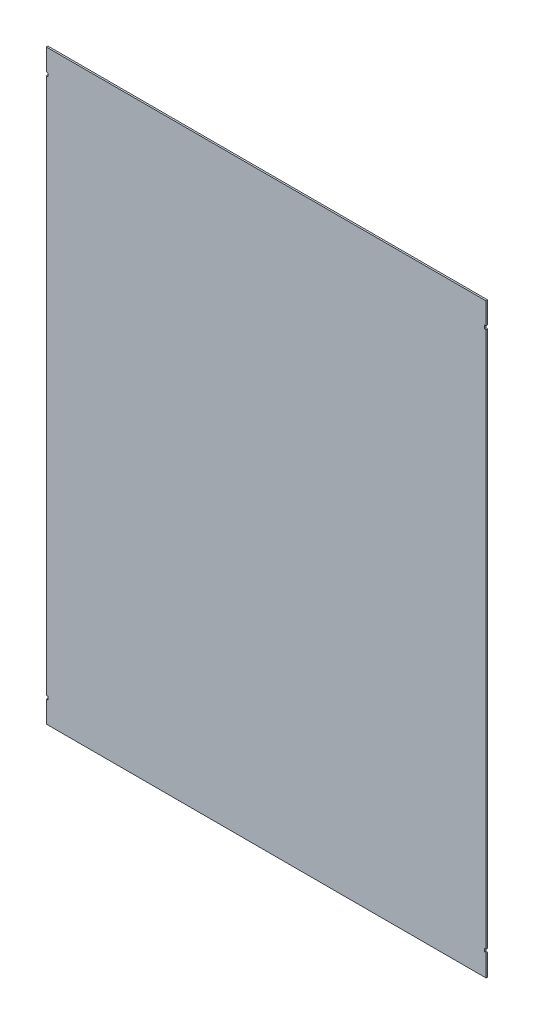
ISO-10303-21;
HEADER;
FILE_DESCRIPTION(('STEP AP214'),'2;1');
FILE_NAME('part.step','',(''),(''),'','','');
FILE_SCHEMA(('AUTOMOTIVE_DESIGN { 1 0 10303 214 1 1 1 1 }'));
ENDSEC;
DATA;
#1=APPLICATION_CONTEXT('core data for automotive mechanical design processes');
#2=APPLICATION_PROTOCOL_DEFINITION('international standard','automotive_design',2000,#1);
#3=PRODUCT_CONTEXT('',#1,'mechanical');
#4=PRODUCT('Part','Part','',(#3));
#5=PRODUCT_RELATED_PRODUCT_CATEGORY('part','',(#4));
#6=PRODUCT_DEFINITION_FORMATION('','',#4);
#7=PRODUCT_DEFINITION_CONTEXT('part definition',#1,'design');
#8=PRODUCT_DEFINITION('design','',#6,#7);
#9=PRODUCT_DEFINITION_SHAPE('','',#8);
#10=(LENGTH_UNIT() NAMED_UNIT(*) SI_UNIT(.MILLI.,.METRE.));
#11=(NAMED_UNIT(*) PLANE_ANGLE_UNIT() SI_UNIT($,.RADIAN.));
#12=(NAMED_UNIT(*) SI_UNIT($,.STERADIAN.) SOLID_ANGLE_UNIT());
#13=UNCERTAINTY_MEASURE_WITH_UNIT(LENGTH_MEASURE(1.E-05),#10,'distance_accuracy_value','');
#14=(GEOMETRIC_REPRESENTATION_CONTEXT(3) GLOBAL_UNCERTAINTY_ASSIGNED_CONTEXT((#13)) GLOBAL_UNIT_ASSIGNED_CONTEXT((#10,
#11,#12)) REPRESENTATION_CONTEXT('',''));
#15=CARTESIAN_POINT('',(0.,0.,0.));
#16=DIRECTION('',(0.,0.,1.));
#17=DIRECTION('',(1.,0.,0.));
#18=AXIS2_PLACEMENT_3D('',#15,#16,#17);
#19=CARTESIAN_POINT('',(0.,0.,3.175));
#20=DIRECTION('',(0.,0.,-1.));
#21=DIRECTION('',(-1.,0.,0.));
#22=AXIS2_PLACEMENT_3D('',#19,#20,#21);
#23=PLANE('',#22);
#24=DIRECTION('',(-1.,0.,0.));
#25=VECTOR('',#24,1.);
#26=CARTESIAN_POINT('',(838.2,1069.99545320751,3.175));
#27=LINE('',#26,#25);
#28=CARTESIAN_POINT('',(838.2,1069.99545320751,3.175));
#29=VERTEX_POINT('',#28);
#30=CARTESIAN_POINT('',(835.025,1069.99545320751,3.175));
#31=VERTEX_POINT('',#30);
#32=EDGE_CURVE('E264',#29,#31,#27,.T.);
#33=ORIENTED_EDGE('',*,*,#32,.T.);
#34=DIRECTION('',(0.,1.,0.));
#35=VECTOR('',#34,1.);
#36=CARTESIAN_POINT('',(835.025,1076.34545320751,3.175));
#37=LINE('',#36,#35);
#38=CARTESIAN_POINT('',(835.025,1076.34545320751,3.175));
#39=VERTEX_POINT('',#38);
#40=EDGE_CURVE('E191',#31,#39,#37,.T.);
#41=ORIENTED_EDGE('',*,*,#40,.T.);
#42=DIRECTION('',(1.,0.,0.));
#43=VECTOR('',#42,1.);
#44=CARTESIAN_POINT('',(838.2,1076.34545320751,3.175));
#45=LINE('',#44,#43);
#46=CARTESIAN_POINT('',(838.2,1076.34545320751,3.175));
#47=VERTEX_POINT('',#46);
#48=EDGE_CURVE('E179',#39,#47,#45,.T.);
#49=ORIENTED_EDGE('',*,*,#48,.T.);
#50=DIRECTION('',(0.,1.,0.));
#51=VECTOR('',#50,1.);
#52=CARTESIAN_POINT('',(838.2,0.,3.175));
#53=LINE('',#52,#51);
#54=CARTESIAN_POINT('',(838.2,1117.6,3.175));
#55=VERTEX_POINT('',#54);
#56=EDGE_CURVE('E188',#47,#55,#53,.T.);
#57=ORIENTED_EDGE('',*,*,#56,.T.);
#58=DIRECTION('',(-1.,0.,0.));
#59=VECTOR('',#58,1.);
#60=CARTESIAN_POINT('',(0.,1117.6,3.175));
#61=LINE('',#60,#59);
#62=CARTESIAN_POINT('',(0.,1117.6,3.175));
#63=VERTEX_POINT('',#62);
#64=EDGE_CURVE('E206',#55,#63,#61,.T.);
#65=ORIENTED_EDGE('',*,*,#64,.T.);
#66=DIRECTION('',(0.,-1.,0.));
#67=VECTOR('',#66,1.);
#68=CARTESIAN_POINT('',(0.,0.,3.175));
#69=LINE('',#68,#67);
#70=CARTESIAN_POINT('',(0.,1076.34545320751,3.175));
#71=VERTEX_POINT('',#70);
#72=EDGE_CURVE('E202',#63,#71,#69,.T.);
#73=ORIENTED_EDGE('',*,*,#72,.T.);
#74=DIRECTION('',(-1.,0.,0.));
#75=VECTOR('',#74,1.);
#76=CARTESIAN_POINT('',(0.,1076.34545320751,3.175));
#77=LINE('',#76,#75);
#78=CARTESIAN_POINT('',(3.17500000000001,1076.34545320751,3.175));
#79=VERTEX_POINT('',#78);
#80=EDGE_CURVE('E341',#79,#71,#77,.T.);
#81=ORIENTED_EDGE('',*,*,#80,.F.);
#82=DIRECTION('',(0.,1.,0.));
#83=VECTOR('',#82,1.);
#84=CARTESIAN_POINT('',(3.17500000000001,1076.34545320751,3.175));
#85=LINE('',#84,#83);
#86=CARTESIAN_POINT('',(3.17500000000001,1069.99545320751,3.175));
#87=VERTEX_POINT('',#86);
#88=EDGE_CURVE('E338',#87,#79,#85,.T.);
#89=ORIENTED_EDGE('',*,*,#88,.F.);
#90=DIRECTION('',(1.,0.,0.));
#91=VECTOR('',#90,1.);
#92=CARTESIAN_POINT('',(0.,1069.99545320751,3.175));
#93=LINE('',#92,#91);
#94=CARTESIAN_POINT('',(0.,1069.99545320751,3.175));
#95=VERTEX_POINT('',#94);
#96=EDGE_CURVE('E330',#95,#87,#93,.T.);
#97=ORIENTED_EDGE('',*,*,#96,.F.);
#98=CARTESIAN_POINT('',(0.,47.6045467924864,3.175));
#99=VERTEX_POINT('',#98);
#100=EDGE_CURVE('E286',#95,#99,#69,.T.);
#101=ORIENTED_EDGE('',*,*,#100,.T.);
#102=DIRECTION('',(1.,0.,0.));
#103=VECTOR('',#102,1.);
#104=CARTESIAN_POINT('',(0.,47.6045467924864,3.175));
#105=LINE('',#104,#103);
#106=CARTESIAN_POINT('',(3.17500000000001,47.6045467924864,3.175));
#107=VERTEX_POINT('',#106);
#108=EDGE_CURVE('E324',#99,#107,#105,.T.);
#109=ORIENTED_EDGE('',*,*,#108,.T.);
#110=DIRECTION('',(0.,-1.,0.));
#111=VECTOR('',#110,1.);
#112=CARTESIAN_POINT('',(3.17500000000001,41.2545467924863,3.175));
#113=LINE('',#112,#111);
#114=CARTESIAN_POINT('',(3.17500000000001,41.2545467924863,3.175));
#115=VERTEX_POINT('',#114);
#116=EDGE_CURVE('E317',#107,#115,#113,.T.);
#117=ORIENTED_EDGE('',*,*,#116,.T.);
#118=DIRECTION('',(-1.,0.,0.));
#119=VECTOR('',#118,1.);
#120=CARTESIAN_POINT('',(0.,41.2545467924863,3.175));
#121=LINE('',#120,#119);
#122=CARTESIAN_POINT('',(0.,41.2545467924863,3.175));
#123=VERTEX_POINT('',#122);
#124=EDGE_CURVE('E296',#115,#123,#121,.T.);
#125=ORIENTED_EDGE('',*,*,#124,.T.);
#126=CARTESIAN_POINT('',(0.,0.,3.175));
#127=VERTEX_POINT('',#126);
#128=EDGE_CURVE('E228',#123,#127,#69,.T.);
#129=ORIENTED_EDGE('',*,*,#128,.T.);
#130=DIRECTION('',(1.,0.,0.));
#131=VECTOR('',#130,1.);
#132=CARTESIAN_POINT('',(0.,0.,3.175));
#133=LINE('',#132,#131);
#134=CARTESIAN_POINT('',(838.2,0.,3.175));
#135=VERTEX_POINT('',#134);
#136=EDGE_CURVE('E198',#127,#135,#133,.T.);
#137=ORIENTED_EDGE('',*,*,#136,.T.);
#138=CARTESIAN_POINT('',(838.2,41.2545467924863,3.175));
#139=VERTEX_POINT('',#138);
#140=EDGE_CURVE('E200',#135,#139,#53,.T.);
#141=ORIENTED_EDGE('',*,*,#140,.T.);
#142=DIRECTION('',(1.,0.,0.));
#143=VECTOR('',#142,1.);
#144=CARTESIAN_POINT('',(838.2,41.2545467924863,3.175));
#145=LINE('',#144,#143);
#146=CARTESIAN_POINT('',(835.025,41.2545467924863,3.175));
#147=VERTEX_POINT('',#146);
#148=EDGE_CURVE('E314',#147,#139,#145,.T.);
#149=ORIENTED_EDGE('',*,*,#148,.F.);
#150=DIRECTION('',(0.,-1.,0.));
#151=VECTOR('',#150,1.);
#152=CARTESIAN_POINT('',(835.025,41.2545467924863,3.175));
#153=LINE('',#152,#151);
#154=CARTESIAN_POINT('',(835.025,47.6045467924864,3.175));
#155=VERTEX_POINT('',#154);
#156=EDGE_CURVE('E640',#155,#147,#153,.T.);
#157=ORIENTED_EDGE('',*,*,#156,.F.);
#158=DIRECTION('',(-1.,0.,0.));
#159=VECTOR('',#158,1.);
#160=CARTESIAN_POINT('',(838.2,47.6045467924864,3.175));
#161=LINE('',#160,#159);
#162=CARTESIAN_POINT('',(838.2,47.6045467924864,3.175));
#163=VERTEX_POINT('',#162);
#164=EDGE_CURVE('E271',#163,#155,#161,.T.);
#165=ORIENTED_EDGE('',*,*,#164,.F.);
#166=EDGE_CURVE('E197',#163,#29,#53,.T.);
#167=ORIENTED_EDGE('',*,*,#166,.T.);
#168=EDGE_LOOP('',(#33,#41,#49,#57,#65,#73,#81,#89,#97,#101,#109,#117,#125,#129,#137,#141,#149,
#157,#165,#167));
#169=FACE_BOUND('',#168,.T.);
#170=ADVANCED_FACE('F39',(#169),#23,.F.);
#171=CARTESIAN_POINT('',(0.,0.,0.));
#172=DIRECTION('',(0.,0.,-1.));
#173=DIRECTION('',(-1.,0.,0.));
#174=AXIS2_PLACEMENT_3D('',#171,#172,#173);
#175=PLANE('',#174);
#176=DIRECTION('',(0.,-1.,0.));
#177=VECTOR('',#176,1.);
#178=CARTESIAN_POINT('',(835.025,0.,0.));
#179=LINE('',#178,#177);
#180=CARTESIAN_POINT('',(835.025,1076.34545320751,0.));
#181=VERTEX_POINT('',#180);
#182=CARTESIAN_POINT('',(835.025,1069.99545320751,0.));
#183=VERTEX_POINT('',#182);
#184=EDGE_CURVE('E11',#181,#183,#179,.T.);
#185=ORIENTED_EDGE('',*,*,#184,.T.);
#186=DIRECTION('',(1.,0.,0.));
#187=VECTOR('',#186,1.);
#188=CARTESIAN_POINT('',(0.,1069.99545320751,0.));
#189=LINE('',#188,#187);
#190=CARTESIAN_POINT('',(838.2,1069.99545320751,0.));
#191=VERTEX_POINT('',#190);
#192=EDGE_CURVE('E262',#183,#191,#189,.T.);
#193=ORIENTED_EDGE('',*,*,#192,.T.);
#194=DIRECTION('',(0.,1.,0.));
#195=VECTOR('',#194,1.);
#196=CARTESIAN_POINT('',(838.2,0.,0.));
#197=LINE('',#196,#195);
#198=CARTESIAN_POINT('',(838.2,47.6045467924864,0.));
#199=VERTEX_POINT('',#198);
#200=EDGE_CURVE('E227',#199,#191,#197,.T.);
#201=ORIENTED_EDGE('',*,*,#200,.F.);
#202=DIRECTION('',(1.,0.,0.));
#203=VECTOR('',#202,1.);
#204=CARTESIAN_POINT('',(0.,47.6045467924864,0.));
#205=LINE('',#204,#203);
#206=CARTESIAN_POINT('',(835.025,47.6045467924864,0.));
#207=VERTEX_POINT('',#206);
#208=EDGE_CURVE('E62',#207,#199,#205,.T.);
#209=ORIENTED_EDGE('',*,*,#208,.F.);
#210=DIRECTION('',(0.,1.,0.));
#211=VECTOR('',#210,1.);
#212=CARTESIAN_POINT('',(835.025,0.,0.));
#213=LINE('',#212,#211);
#214=CARTESIAN_POINT('',(835.025,41.2545467924863,0.));
#215=VERTEX_POINT('',#214);
#216=EDGE_CURVE('E184',#215,#207,#213,.T.);
#217=ORIENTED_EDGE('',*,*,#216,.F.);
#218=DIRECTION('',(-1.,0.,0.));
#219=VECTOR('',#218,1.);
#220=CARTESIAN_POINT('',(0.,41.2545467924863,0.));
#221=LINE('',#220,#219);
#222=CARTESIAN_POINT('',(838.2,41.2545467924863,0.));
#223=VERTEX_POINT('',#222);
#224=EDGE_CURVE('E312',#223,#215,#221,.T.);
#225=ORIENTED_EDGE('',*,*,#224,.F.);
#226=CARTESIAN_POINT('',(838.2,0.,0.));
#227=VERTEX_POINT('',#226);
#228=EDGE_CURVE('E223',#227,#223,#197,.T.);
#229=ORIENTED_EDGE('',*,*,#228,.F.);
#230=DIRECTION('',(1.,0.,0.));
#231=VECTOR('',#230,1.);
#232=CARTESIAN_POINT('',(0.,0.,0.));
#233=LINE('',#232,#231);
#234=CARTESIAN_POINT('',(0.,0.,0.));
#235=VERTEX_POINT('',#234);
#236=EDGE_CURVE('E218',#235,#227,#233,.T.);
#237=ORIENTED_EDGE('',*,*,#236,.F.);
#238=DIRECTION('',(0.,-1.,0.));
#239=VECTOR('',#238,1.);
#240=CARTESIAN_POINT('',(0.,0.,0.));
#241=LINE('',#240,#239);
#242=CARTESIAN_POINT('',(0.,41.2545467924863,0.));
#243=VERTEX_POINT('',#242);
#244=EDGE_CURVE('E220',#243,#235,#241,.T.);
#245=ORIENTED_EDGE('',*,*,#244,.F.);
#246=DIRECTION('',(1.,0.,0.));
#247=VECTOR('',#246,1.);
#248=CARTESIAN_POINT('',(0.,41.2545467924863,0.));
#249=LINE('',#248,#247);
#250=CARTESIAN_POINT('',(3.17500000000001,41.2545467924863,0.));
#251=VERTEX_POINT('',#250);
#252=EDGE_CURVE('E244',#243,#251,#249,.T.);
#253=ORIENTED_EDGE('',*,*,#252,.T.);
#254=DIRECTION('',(0.,1.,0.));
#255=VECTOR('',#254,1.);
#256=CARTESIAN_POINT('',(3.17500000000001,0.,0.));
#257=LINE('',#256,#255);
#258=CARTESIAN_POINT('',(3.17500000000001,47.6045467924864,0.));
#259=VERTEX_POINT('',#258);
#260=EDGE_CURVE('E247',#251,#259,#257,.T.);
#261=ORIENTED_EDGE('',*,*,#260,.T.);
#262=DIRECTION('',(-1.,0.,0.));
#263=VECTOR('',#262,1.);
#264=CARTESIAN_POINT('',(0.,47.6045467924864,0.));
#265=LINE('',#264,#263);
#266=CARTESIAN_POINT('',(0.,47.6045467924864,0.));
#267=VERTEX_POINT('',#266);
#268=EDGE_CURVE('E250',#259,#267,#265,.T.);
#269=ORIENTED_EDGE('',*,*,#268,.T.);
#270=CARTESIAN_POINT('',(0.,1069.99545320751,0.));
#271=VERTEX_POINT('',#270);
#272=EDGE_CURVE('E219',#271,#267,#241,.T.);
#273=ORIENTED_EDGE('',*,*,#272,.F.);
#274=DIRECTION('',(-1.,0.,0.));
#275=VECTOR('',#274,1.);
#276=CARTESIAN_POINT('',(0.,1069.99545320751,0.));
#277=LINE('',#276,#275);
#278=CARTESIAN_POINT('',(3.17500000000001,1069.99545320751,0.));
#279=VERTEX_POINT('',#278);
#280=EDGE_CURVE('E237',#279,#271,#277,.T.);
#281=ORIENTED_EDGE('',*,*,#280,.F.);
#282=DIRECTION('',(0.,-1.,0.));
#283=VECTOR('',#282,1.);
#284=CARTESIAN_POINT('',(3.17500000000001,0.,0.));
#285=LINE('',#284,#283);
#286=CARTESIAN_POINT('',(3.17500000000001,1076.34545320751,0.));
#287=VERTEX_POINT('',#286);
#288=EDGE_CURVE('E239',#287,#279,#285,.T.);
#289=ORIENTED_EDGE('',*,*,#288,.F.);
#290=DIRECTION('',(1.,0.,0.));
#291=VECTOR('',#290,1.);
#292=CARTESIAN_POINT('',(0.,1076.34545320751,0.));
#293=LINE('',#292,#291);
#294=CARTESIAN_POINT('',(0.,1076.34545320751,0.));
#295=VERTEX_POINT('',#294);
#296=EDGE_CURVE('E242',#295,#287,#293,.T.);
#297=ORIENTED_EDGE('',*,*,#296,.F.);
#298=CARTESIAN_POINT('',(0.,1117.6,0.));
#299=VERTEX_POINT('',#298);
#300=EDGE_CURVE('E215',#299,#295,#241,.T.);
#301=ORIENTED_EDGE('',*,*,#300,.F.);
#302=DIRECTION('',(-1.,0.,0.));
#303=VECTOR('',#302,1.);
#304=CARTESIAN_POINT('',(0.,1117.6,0.));
#305=LINE('',#304,#303);
#306=CARTESIAN_POINT('',(838.2,1117.6,0.));
#307=VERTEX_POINT('',#306);
#308=EDGE_CURVE('E226',#307,#299,#305,.T.);
#309=ORIENTED_EDGE('',*,*,#308,.F.);
#310=CARTESIAN_POINT('',(838.2,1076.34545320751,0.));
#311=VERTEX_POINT('',#310);
#312=EDGE_CURVE('E222',#311,#307,#197,.T.);
#313=ORIENTED_EDGE('',*,*,#312,.F.);
#314=DIRECTION('',(-1.,0.,0.));
#315=VECTOR('',#314,1.);
#316=CARTESIAN_POINT('',(0.,1076.34545320751,0.));
#317=LINE('',#316,#315);
#318=EDGE_CURVE('E54',#311,#181,#317,.T.);
#319=ORIENTED_EDGE('',*,*,#318,.T.);
#320=EDGE_LOOP('',(#185,#193,#201,#209,#217,#225,#229,#237,#245,#253,#261,#269,#273,#281,#289,
#297,#301,#309,#313,#319));
#321=FACE_BOUND('',#320,.T.);
#322=ADVANCED_FACE('F270',(#321),#175,.T.);
#323=CARTESIAN_POINT('',(838.2,0.,3.175));
#324=DIRECTION('',(-1.,0.,0.));
#325=DIRECTION('',(0.,0.,1.));
#326=AXIS2_PLACEMENT_3D('',#323,#324,#325);
#327=PLANE('',#326);
#328=DIRECTION('',(0.,0.,-1.));
#329=VECTOR('',#328,1.);
#330=CARTESIAN_POINT('',(838.2,1069.99545320751,3.175));
#331=LINE('',#330,#329);
#332=EDGE_CURVE('E47',#29,#191,#331,.T.);
#333=ORIENTED_EDGE('',*,*,#332,.F.);
#334=ORIENTED_EDGE('',*,*,#166,.F.);
#335=DIRECTION('',(0.,0.,-1.));
#336=VECTOR('',#335,1.);
#337=CARTESIAN_POINT('',(838.2,47.6045467924864,3.175));
#338=LINE('',#337,#336);
#339=EDGE_CURVE('E253',#163,#199,#338,.T.);
#340=ORIENTED_EDGE('',*,*,#339,.T.);
#341=ORIENTED_EDGE('',*,*,#200,.T.);
#342=EDGE_LOOP('',(#333,#334,#340,#341));
#343=FACE_BOUND('',#342,.T.);
#344=ADVANCED_FACE('F273',(#343),#327,.F.);
#345=DIRECTION('',(0.,0.,1.));
#346=VECTOR('',#345,1.);
#347=CARTESIAN_POINT('',(838.2,1076.34545320751,3.175));
#348=LINE('',#347,#346);
#349=EDGE_CURVE('E176',#311,#47,#348,.T.);
#350=ORIENTED_EDGE('',*,*,#349,.F.);
#351=ORIENTED_EDGE('',*,*,#312,.T.);
#352=DIRECTION('',(0.,0.,-1.));
#353=VECTOR('',#352,1.);
#354=CARTESIAN_POINT('',(838.2,1117.6,3.175));
#355=LINE('',#354,#353);
#356=EDGE_CURVE('E195',#55,#307,#355,.T.);
#357=ORIENTED_EDGE('',*,*,#356,.F.);
#358=ORIENTED_EDGE('',*,*,#56,.F.);
#359=EDGE_LOOP('',(#350,#351,#357,#358));
#360=FACE_BOUND('',#359,.T.);
#361=ADVANCED_FACE('F193',(#360),#327,.F.);
#362=ORIENTED_EDGE('',*,*,#228,.T.);
#363=DIRECTION('',(0.,0.,1.));
#364=VECTOR('',#363,1.);
#365=CARTESIAN_POINT('',(838.2,41.2545467924863,3.175));
#366=LINE('',#365,#364);
#367=EDGE_CURVE('E255',#223,#139,#366,.T.);
#368=ORIENTED_EDGE('',*,*,#367,.T.);
#369=ORIENTED_EDGE('',*,*,#140,.F.);
#370=DIRECTION('',(0.,0.,-1.));
#371=VECTOR('',#370,1.);
#372=CARTESIAN_POINT('',(838.2,0.,3.175));
#373=LINE('',#372,#371);
#374=EDGE_CURVE('E231',#135,#227,#373,.T.);
#375=ORIENTED_EDGE('',*,*,#374,.T.);
#376=EDGE_LOOP('',(#362,#368,#369,#375));
#377=FACE_BOUND('',#376,.T.);
#378=ADVANCED_FACE('F309',(#377),#327,.F.);
#379=CARTESIAN_POINT('',(0.,0.,3.175));
#380=DIRECTION('',(1.,0.,0.));
#381=DIRECTION('',(0.,0.,-1.));
#382=AXIS2_PLACEMENT_3D('',#379,#380,#381);
#383=PLANE('',#382);
#384=DIRECTION('',(0.,0.,1.));
#385=VECTOR('',#384,1.);
#386=CARTESIAN_POINT('',(0.,47.6045467924864,-22.225));
#387=LINE('',#386,#385);
#388=EDGE_CURVE('E327',#267,#99,#387,.T.);
#389=ORIENTED_EDGE('',*,*,#388,.T.);
#390=ORIENTED_EDGE('',*,*,#100,.F.);
#391=DIRECTION('',(0.,0.,1.));
#392=VECTOR('',#391,1.);
#393=CARTESIAN_POINT('',(0.,1069.99545320751,-22.225));
#394=LINE('',#393,#392);
#395=EDGE_CURVE('E343',#271,#95,#394,.T.);
#396=ORIENTED_EDGE('',*,*,#395,.F.);
#397=ORIENTED_EDGE('',*,*,#272,.T.);
#398=EDGE_LOOP('',(#389,#390,#396,#397));
#399=FACE_BOUND('',#398,.T.);
#400=ADVANCED_FACE('F41',(#399),#383,.F.);
#401=DIRECTION('',(0.,0.,1.));
#402=VECTOR('',#401,1.);
#403=CARTESIAN_POINT('',(0.,41.2545467924863,-22.225));
#404=LINE('',#403,#402);
#405=EDGE_CURVE('E305',#243,#123,#404,.T.);
#406=ORIENTED_EDGE('',*,*,#405,.F.);
#407=ORIENTED_EDGE('',*,*,#244,.T.);
#408=DIRECTION('',(0.,0.,-1.));
#409=VECTOR('',#408,1.);
#410=CARTESIAN_POINT('',(0.,0.,3.175));
#411=LINE('',#410,#409);
#412=EDGE_CURVE('E234',#127,#235,#411,.T.);
#413=ORIENTED_EDGE('',*,*,#412,.F.);
#414=ORIENTED_EDGE('',*,*,#128,.F.);
#415=EDGE_LOOP('',(#406,#407,#413,#414));
#416=FACE_BOUND('',#415,.T.);
#417=ADVANCED_FACE('F302',(#416),#383,.F.);
#418=ORIENTED_EDGE('',*,*,#300,.T.);
#419=DIRECTION('',(0.,0.,1.));
#420=VECTOR('',#419,1.);
#421=CARTESIAN_POINT('',(0.,1076.34545320751,-22.225));
#422=LINE('',#421,#420);
#423=EDGE_CURVE('E284',#295,#71,#422,.T.);
#424=ORIENTED_EDGE('',*,*,#423,.T.);
#425=ORIENTED_EDGE('',*,*,#72,.F.);
#426=DIRECTION('',(0.,0.,-1.));
#427=VECTOR('',#426,1.);
#428=CARTESIAN_POINT('',(0.,1117.6,3.175));
#429=LINE('',#428,#427);
#430=EDGE_CURVE('E209',#63,#299,#429,.T.);
#431=ORIENTED_EDGE('',*,*,#430,.T.);
#432=EDGE_LOOP('',(#418,#424,#425,#431));
#433=FACE_BOUND('',#432,.T.);
#434=ADVANCED_FACE('F282',(#433),#383,.F.);
#435=CARTESIAN_POINT('',(0.,0.,3.175));
#436=DIRECTION('',(0.,1.,0.));
#437=DIRECTION('',(0.,0.,1.));
#438=AXIS2_PLACEMENT_3D('',#435,#436,#437);
#439=PLANE('',#438);
#440=ORIENTED_EDGE('',*,*,#236,.T.);
#441=ORIENTED_EDGE('',*,*,#374,.F.);
#442=ORIENTED_EDGE('',*,*,#136,.F.);
#443=ORIENTED_EDGE('',*,*,#412,.T.);
#444=EDGE_LOOP('',(#440,#441,#442,#443));
#445=FACE_BOUND('',#444,.T.);
#446=ADVANCED_FACE('F301',(#445),#439,.F.);
#447=CARTESIAN_POINT('',(0.,1117.6,3.175));
#448=DIRECTION('',(0.,-1.,0.));
#449=DIRECTION('',(0.,0.,-1.));
#450=AXIS2_PLACEMENT_3D('',#447,#448,#449);
#451=PLANE('',#450);
#452=ORIENTED_EDGE('',*,*,#308,.T.);
#453=ORIENTED_EDGE('',*,*,#430,.F.);
#454=ORIENTED_EDGE('',*,*,#64,.F.);
#455=ORIENTED_EDGE('',*,*,#356,.T.);
#456=EDGE_LOOP('',(#452,#453,#454,#455));
#457=FACE_BOUND('',#456,.T.);
#458=ADVANCED_FACE('F276',(#457),#451,.F.);
#459=CARTESIAN_POINT('',(0.,1076.34545320751,-22.225));
#460=DIRECTION('',(0.,1.,0.));
#461=DIRECTION('',(0.,0.,1.));
#462=AXIS2_PLACEMENT_3D('',#459,#460,#461);
#463=PLANE('',#462);
#464=ORIENTED_EDGE('',*,*,#296,.T.);
#465=DIRECTION('',(0.,0.,1.));
#466=VECTOR('',#465,1.);
#467=CARTESIAN_POINT('',(3.17500000000001,1076.34545320751,-22.225));
#468=LINE('',#467,#466);
#469=EDGE_CURVE('E345',#287,#79,#468,.T.);
#470=ORIENTED_EDGE('',*,*,#469,.T.);
#471=ORIENTED_EDGE('',*,*,#80,.T.);
#472=ORIENTED_EDGE('',*,*,#423,.F.);
#473=EDGE_LOOP('',(#464,#470,#471,#472));
#474=FACE_BOUND('',#473,.T.);
#475=ADVANCED_FACE('F388',(#474),#463,.F.);
#476=CARTESIAN_POINT('',(3.17500000000001,1076.34545320751,-22.225));
#477=DIRECTION('',(1.,0.,0.));
#478=DIRECTION('',(0.,0.,-1.));
#479=AXIS2_PLACEMENT_3D('',#476,#477,#478);
#480=PLANE('',#479);
#481=ORIENTED_EDGE('',*,*,#288,.T.);
#482=DIRECTION('',(0.,0.,1.));
#483=VECTOR('',#482,1.);
#484=CARTESIAN_POINT('',(3.17500000000001,1069.99545320751,-22.225));
#485=LINE('',#484,#483);
#486=EDGE_CURVE('E347',#279,#87,#485,.T.);
#487=ORIENTED_EDGE('',*,*,#486,.T.);
#488=ORIENTED_EDGE('',*,*,#88,.T.);
#489=ORIENTED_EDGE('',*,*,#469,.F.);
#490=EDGE_LOOP('',(#481,#487,#488,#489));
#491=FACE_BOUND('',#490,.T.);
#492=ADVANCED_FACE('F473',(#491),#480,.F.);
#493=CARTESIAN_POINT('',(0.,1069.99545320751,-22.225));
#494=DIRECTION('',(0.,-1.,0.));
#495=DIRECTION('',(0.,0.,-1.));
#496=AXIS2_PLACEMENT_3D('',#493,#494,#495);
#497=PLANE('',#496);
#498=ORIENTED_EDGE('',*,*,#280,.T.);
#499=ORIENTED_EDGE('',*,*,#395,.T.);
#500=ORIENTED_EDGE('',*,*,#96,.T.);
#501=ORIENTED_EDGE('',*,*,#486,.F.);
#502=EDGE_LOOP('',(#498,#499,#500,#501));
#503=FACE_BOUND('',#502,.T.);
#504=ADVANCED_FACE('F351',(#503),#497,.F.);
#505=CARTESIAN_POINT('',(0.,47.6045467924864,-22.225));
#506=DIRECTION('',(0.,-1.,0.));
#507=DIRECTION('',(0.,0.,-1.));
#508=AXIS2_PLACEMENT_3D('',#505,#506,#507);
#509=PLANE('',#508);
#510=DIRECTION('',(0.,0.,1.));
#511=VECTOR('',#510,1.);
#512=CARTESIAN_POINT('',(3.17500000000001,47.6045467924864,-22.225));
#513=LINE('',#512,#511);
#514=EDGE_CURVE('E331',#259,#107,#513,.T.);
#515=ORIENTED_EDGE('',*,*,#514,.T.);
#516=ORIENTED_EDGE('',*,*,#108,.F.);
#517=ORIENTED_EDGE('',*,*,#388,.F.);
#518=ORIENTED_EDGE('',*,*,#268,.F.);
#519=EDGE_LOOP('',(#515,#516,#517,#518));
#520=FACE_BOUND('',#519,.T.);
#521=ADVANCED_FACE('F359',(#520),#509,.T.);
#522=CARTESIAN_POINT('',(3.17500000000001,41.2545467924863,-22.225));
#523=DIRECTION('',(-1.,0.,0.));
#524=DIRECTION('',(0.,0.,1.));
#525=AXIS2_PLACEMENT_3D('',#522,#523,#524);
#526=PLANE('',#525);
#527=DIRECTION('',(0.,0.,1.));
#528=VECTOR('',#527,1.);
#529=CARTESIAN_POINT('',(3.17500000000001,41.2545467924863,-22.225));
#530=LINE('',#529,#528);
#531=EDGE_CURVE('E333',#251,#115,#530,.T.);
#532=ORIENTED_EDGE('',*,*,#531,.T.);
#533=ORIENTED_EDGE('',*,*,#116,.F.);
#534=ORIENTED_EDGE('',*,*,#514,.F.);
#535=ORIENTED_EDGE('',*,*,#260,.F.);
#536=EDGE_LOOP('',(#532,#533,#534,#535));
#537=FACE_BOUND('',#536,.T.);
#538=ADVANCED_FACE('F363',(#537),#526,.T.);
#539=CARTESIAN_POINT('',(0.,41.2545467924863,-22.225));
#540=DIRECTION('',(0.,1.,0.));
#541=DIRECTION('',(0.,0.,1.));
#542=AXIS2_PLACEMENT_3D('',#539,#540,#541);
#543=PLANE('',#542);
#544=ORIENTED_EDGE('',*,*,#405,.T.);
#545=ORIENTED_EDGE('',*,*,#124,.F.);
#546=ORIENTED_EDGE('',*,*,#531,.F.);
#547=ORIENTED_EDGE('',*,*,#252,.F.);
#548=EDGE_LOOP('',(#544,#545,#546,#547));
#549=FACE_BOUND('',#548,.T.);
#550=ADVANCED_FACE('F366',(#549),#543,.T.);
#551=CARTESIAN_POINT('',(838.2,41.2545467924863,-22.225));
#552=DIRECTION('',(0.,-1.,0.));
#553=DIRECTION('',(0.,0.,-1.));
#554=AXIS2_PLACEMENT_3D('',#551,#552,#553);
#555=PLANE('',#554);
#556=ORIENTED_EDGE('',*,*,#224,.T.);
#557=DIRECTION('',(0.,0.,1.));
#558=VECTOR('',#557,1.);
#559=CARTESIAN_POINT('',(835.025,41.2545467924863,-22.225));
#560=LINE('',#559,#558);
#561=EDGE_CURVE('E319',#215,#147,#560,.T.);
#562=ORIENTED_EDGE('',*,*,#561,.T.);
#563=ORIENTED_EDGE('',*,*,#148,.T.);
#564=ORIENTED_EDGE('',*,*,#367,.F.);
#565=EDGE_LOOP('',(#556,#562,#563,#564));
#566=FACE_BOUND('',#565,.T.);
#567=ADVANCED_FACE('F311',(#566),#555,.F.);
#568=CARTESIAN_POINT('',(835.025,41.2545467924863,-22.225));
#569=DIRECTION('',(-1.,0.,0.));
#570=DIRECTION('',(0.,0.,1.));
#571=AXIS2_PLACEMENT_3D('',#568,#569,#570);
#572=PLANE('',#571);
#573=ORIENTED_EDGE('',*,*,#216,.T.);
#574=DIRECTION('',(0.,0.,1.));
#575=VECTOR('',#574,1.);
#576=CARTESIAN_POINT('',(835.025,47.6045467924864,-22.225));
#577=LINE('',#576,#575);
#578=EDGE_CURVE('E644',#207,#155,#577,.T.);
#579=ORIENTED_EDGE('',*,*,#578,.T.);
#580=ORIENTED_EDGE('',*,*,#156,.T.);
#581=ORIENTED_EDGE('',*,*,#561,.F.);
#582=EDGE_LOOP('',(#573,#579,#580,#581));
#583=FACE_BOUND('',#582,.T.);
#584=ADVANCED_FACE('F373',(#583),#572,.F.);
#585=CARTESIAN_POINT('',(838.2,47.6045467924864,-22.225));
#586=DIRECTION('',(0.,1.,0.));
#587=DIRECTION('',(0.,0.,1.));
#588=AXIS2_PLACEMENT_3D('',#585,#586,#587);
#589=PLANE('',#588);
#590=ORIENTED_EDGE('',*,*,#208,.T.);
#591=ORIENTED_EDGE('',*,*,#339,.F.);
#592=ORIENTED_EDGE('',*,*,#164,.T.);
#593=ORIENTED_EDGE('',*,*,#578,.F.);
#594=EDGE_LOOP('',(#590,#591,#592,#593));
#595=FACE_BOUND('',#594,.T.);
#596=ADVANCED_FACE('F554',(#595),#589,.F.);
#597=CARTESIAN_POINT('',(838.2,1069.99545320751,-22.225));
#598=DIRECTION('',(0.,1.,0.));
#599=DIRECTION('',(0.,0.,1.));
#600=AXIS2_PLACEMENT_3D('',#597,#598,#599);
#601=PLANE('',#600);
#602=DIRECTION('',(0.,0.,1.));
#603=VECTOR('',#602,1.);
#604=CARTESIAN_POINT('',(835.025,1069.99545320751,-22.225));
#605=LINE('',#604,#603);
#606=EDGE_CURVE('E632',#183,#31,#605,.T.);
#607=ORIENTED_EDGE('',*,*,#606,.T.);
#608=ORIENTED_EDGE('',*,*,#32,.F.);
#609=ORIENTED_EDGE('',*,*,#332,.T.);
#610=ORIENTED_EDGE('',*,*,#192,.F.);
#611=EDGE_LOOP('',(#607,#608,#609,#610));
#612=FACE_BOUND('',#611,.T.);
#613=ADVANCED_FACE('F261',(#612),#601,.T.);
#614=CARTESIAN_POINT('',(835.025,1076.34545320751,-22.225));
#615=DIRECTION('',(1.,0.,0.));
#616=DIRECTION('',(0.,0.,-1.));
#617=AXIS2_PLACEMENT_3D('',#614,#615,#616);
#618=PLANE('',#617);
#619=DIRECTION('',(0.,0.,1.));
#620=VECTOR('',#619,1.);
#621=CARTESIAN_POINT('',(835.025,1076.34545320751,-22.225));
#622=LINE('',#621,#620);
#623=EDGE_CURVE('E631',#181,#39,#622,.T.);
#624=ORIENTED_EDGE('',*,*,#623,.T.);
#625=ORIENTED_EDGE('',*,*,#40,.F.);
#626=ORIENTED_EDGE('',*,*,#606,.F.);
#627=ORIENTED_EDGE('',*,*,#184,.F.);
#628=EDGE_LOOP('',(#624,#625,#626,#627));
#629=FACE_BOUND('',#628,.T.);
#630=ADVANCED_FACE('F576',(#629),#618,.T.);
#631=CARTESIAN_POINT('',(838.2,1076.34545320751,-22.225));
#632=DIRECTION('',(0.,-1.,0.));
#633=DIRECTION('',(0.,0.,-1.));
#634=AXIS2_PLACEMENT_3D('',#631,#632,#633);
#635=PLANE('',#634);
#636=ORIENTED_EDGE('',*,*,#349,.T.);
#637=ORIENTED_EDGE('',*,*,#48,.F.);
#638=ORIENTED_EDGE('',*,*,#623,.F.);
#639=ORIENTED_EDGE('',*,*,#318,.F.);
#640=EDGE_LOOP('',(#636,#637,#638,#639));
#641=FACE_BOUND('',#640,.T.);
#642=ADVANCED_FACE('F178',(#641),#635,.T.);
#643=CLOSED_SHELL('',(#170,#322,#344,#361,#378,#400,#417,#434,#446,#458,#475,#492,#504,#521,
#538,#550,#567,#584,#596,#613,#630,#642));
#644=MANIFOLD_SOLID_BREP('B2',#643);
#645=ADVANCED_BREP_SHAPE_REPRESENTATION('',(#18,#644),#14);
#646=SHAPE_DEFINITION_REPRESENTATION(#9,#645);
ENDSEC;
END-ISO-10303-21;
